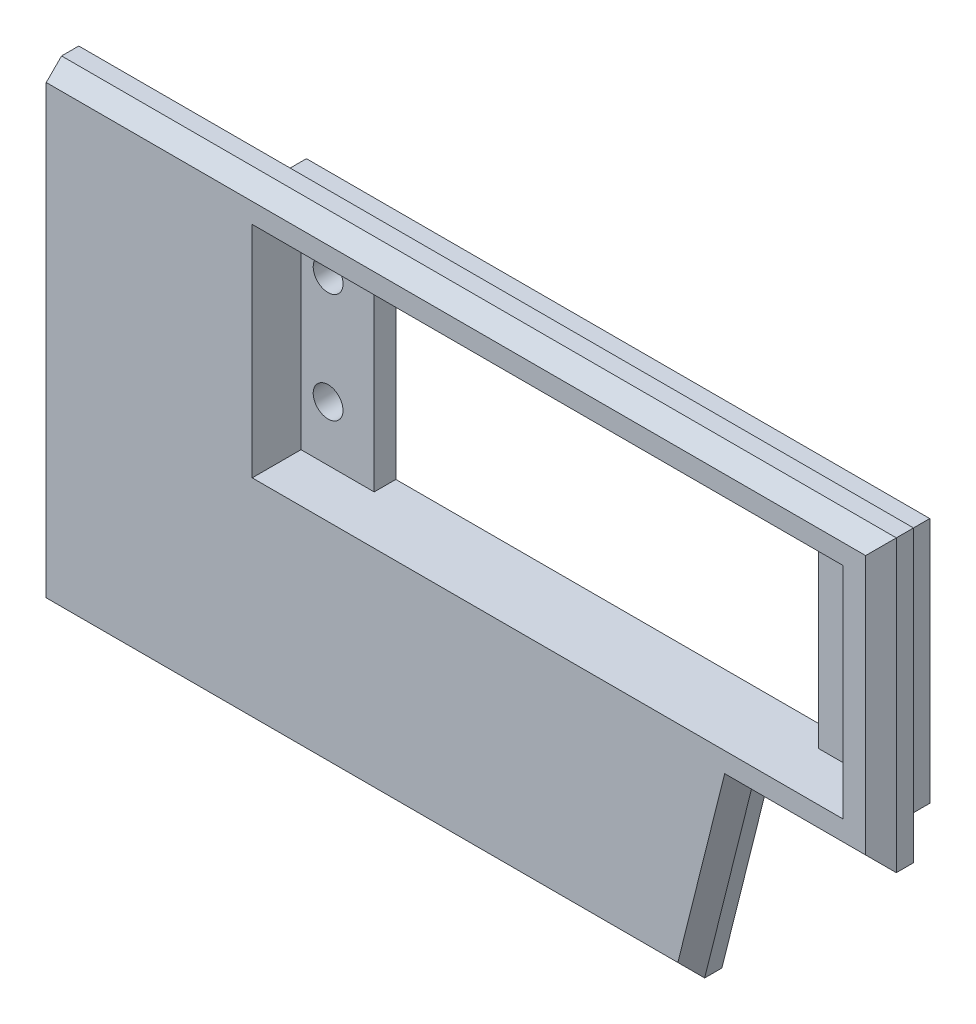
ISO-10303-21;
HEADER;
FILE_DESCRIPTION(('STEP AP214'),'2;1');
FILE_NAME('part.step','',(''),(''),'','','');
FILE_SCHEMA(('AUTOMOTIVE_DESIGN { 1 0 10303 214 1 1 1 1 }'));
ENDSEC;
DATA;
#1=APPLICATION_CONTEXT('core data for automotive mechanical design processes');
#2=APPLICATION_PROTOCOL_DEFINITION('international standard','automotive_design',2000,#1);
#3=PRODUCT_CONTEXT('',#1,'mechanical');
#4=PRODUCT('Part','Part','',(#3));
#5=PRODUCT_RELATED_PRODUCT_CATEGORY('part','',(#4));
#6=PRODUCT_DEFINITION_FORMATION('','',#4);
#7=PRODUCT_DEFINITION_CONTEXT('part definition',#1,'design');
#8=PRODUCT_DEFINITION('design','',#6,#7);
#9=PRODUCT_DEFINITION_SHAPE('','',#8);
#10=(LENGTH_UNIT() NAMED_UNIT(*) SI_UNIT(.MILLI.,.METRE.));
#11=(NAMED_UNIT(*) PLANE_ANGLE_UNIT() SI_UNIT($,.RADIAN.));
#12=(NAMED_UNIT(*) SI_UNIT($,.STERADIAN.) SOLID_ANGLE_UNIT());
#13=UNCERTAINTY_MEASURE_WITH_UNIT(LENGTH_MEASURE(1.E-05),#10,'distance_accuracy_value','');
#14=(GEOMETRIC_REPRESENTATION_CONTEXT(3) GLOBAL_UNCERTAINTY_ASSIGNED_CONTEXT((#13)) GLOBAL_UNIT_ASSIGNED_CONTEXT((#10,
#11,#12)) REPRESENTATION_CONTEXT('',''));
#15=CARTESIAN_POINT('',(0.,0.,0.));
#16=DIRECTION('',(0.,0.,1.));
#17=DIRECTION('',(1.,0.,0.));
#18=AXIS2_PLACEMENT_3D('',#15,#16,#17);
#19=CARTESIAN_POINT('',(-40.767008156925,24.,3.));
#20=DIRECTION('',(1.,0.,0.));
#21=DIRECTION('',(0.,1.,0.));
#22=AXIS2_PLACEMENT_3D('',#19,#20,#21);
#23=PLANE('',#22);
#24=DIRECTION('',(0.,0.,-1.));
#25=VECTOR('',#24,1.);
#26=CARTESIAN_POINT('',(-40.767008156925,-3.99999999999996,21.0581800256037));
#27=LINE('',#26,#25);
#28=CARTESIAN_POINT('',(-40.767008156925,-3.99999999999996,1.5));
#29=VERTEX_POINT('',#28);
#30=CARTESIAN_POINT('',(-40.767008156925,-3.99999999999996,0.));
#31=VERTEX_POINT('',#30);
#32=EDGE_CURVE('E212',#29,#31,#27,.T.);
#33=ORIENTED_EDGE('',*,*,#32,.F.);
#34=DIRECTION('',(0.,-1.,0.));
#35=VECTOR('',#34,1.);
#36=CARTESIAN_POINT('',(-40.767008156925,-3.99999999999996,1.5));
#37=LINE('',#36,#35);
#38=CARTESIAN_POINT('',(-40.767008156925,-6.99999999999996,1.5));
#39=VERTEX_POINT('',#38);
#40=EDGE_CURVE('E331',#29,#39,#37,.T.);
#41=ORIENTED_EDGE('',*,*,#40,.T.);
#42=DIRECTION('',(0.,0.,-1.));
#43=VECTOR('',#42,1.);
#44=CARTESIAN_POINT('',(-40.767008156925,-6.99999999999996,21.0581800256037));
#45=LINE('',#44,#43);
#46=CARTESIAN_POINT('',(-40.767008156925,-6.99999999999996,0.));
#47=VERTEX_POINT('',#46);
#48=EDGE_CURVE('E332',#39,#47,#45,.T.);
#49=ORIENTED_EDGE('',*,*,#48,.T.);
#50=DIRECTION('',(0.,-1.,0.));
#51=VECTOR('',#50,1.);
#52=CARTESIAN_POINT('',(-40.767008156925,24.,0.));
#53=LINE('',#52,#51);
#54=CARTESIAN_POINT('',(-40.767008156925,-20.,0.));
#55=VERTEX_POINT('',#54);
#56=EDGE_CURVE('E239',#47,#55,#53,.T.);
#57=ORIENTED_EDGE('',*,*,#56,.T.);
#58=DIRECTION('',(0.,0.,-1.));
#59=VECTOR('',#58,1.);
#60=CARTESIAN_POINT('',(-40.767008156925,-20.,3.));
#61=LINE('',#60,#59);
#62=CARTESIAN_POINT('',(-40.767008156925,-20.0000000000001,1.58578643762691));
#63=VERTEX_POINT('',#62);
#64=EDGE_CURVE('E248',#63,#55,#61,.T.);
#65=ORIENTED_EDGE('',*,*,#64,.F.);
#66=DIRECTION('',(0.,0.707106781186547,0.707106781186548));
#67=VECTOR('',#66,1.);
#68=CARTESIAN_POINT('',(-40.767008156925,-18.585786437627,3.));
#69=LINE('',#68,#67);
#70=CARTESIAN_POINT('',(-40.767008156925,-18.585786437627,3.));
#71=VERTEX_POINT('',#70);
#72=EDGE_CURVE('E288',#63,#71,#69,.T.);
#73=ORIENTED_EDGE('',*,*,#72,.T.);
#74=DIRECTION('',(0.,-1.,0.));
#75=VECTOR('',#74,1.);
#76=CARTESIAN_POINT('',(-40.767008156925,24.,3.));
#77=LINE('',#76,#75);
#78=CARTESIAN_POINT('',(-40.767008156925,22.5857864376268,3.));
#79=VERTEX_POINT('',#78);
#80=EDGE_CURVE('E241',#79,#71,#77,.T.);
#81=ORIENTED_EDGE('',*,*,#80,.F.);
#82=DIRECTION('',(0.,0.707106781186548,-0.707106781186547));
#83=VECTOR('',#82,1.);
#84=CARTESIAN_POINT('',(-40.767008156925,12.7928932188134,12.7928932188134));
#85=LINE('',#84,#83);
#86=CARTESIAN_POINT('',(-40.767008156925,24.,1.58578643762686));
#87=VERTEX_POINT('',#86);
#88=EDGE_CURVE('E290',#79,#87,#85,.T.);
#89=ORIENTED_EDGE('',*,*,#88,.T.);
#90=DIRECTION('',(0.,0.,-1.));
#91=VECTOR('',#90,1.);
#92=CARTESIAN_POINT('',(-40.767008156925,24.,3.));
#93=LINE('',#92,#91);
#94=CARTESIAN_POINT('',(-40.767008156925,24.,0.));
#95=VERTEX_POINT('',#94);
#96=EDGE_CURVE('E233',#87,#95,#93,.T.);
#97=ORIENTED_EDGE('',*,*,#96,.T.);
#98=EDGE_CURVE('E228',#95,#31,#53,.T.);
#99=ORIENTED_EDGE('',*,*,#98,.T.);
#100=EDGE_LOOP('',(#33,#41,#49,#57,#65,#73,#81,#89,#97,#99));
#101=FACE_BOUND('',#100,.T.);
#102=ADVANCED_FACE('F44',(#101),#23,.F.);
#103=CARTESIAN_POINT('',(0.,0.,-1.5));
#104=DIRECTION('',(0.,0.,1.));
#105=DIRECTION('',(1.,0.,0.));
#106=AXIS2_PLACEMENT_3D('',#103,#104,#105);
#107=PLANE('',#106);
#108=CARTESIAN_POINT('',(30.232991843075,5.57500000000003,-1.5));
#109=DIRECTION('',(0.,0.,1.));
#110=DIRECTION('',(-1.,0.,0.));
#111=AXIS2_PLACEMENT_3D('',#108,#109,#110);
#112=CIRCLE('',#111,1.375);
#113=CARTESIAN_POINT('',(28.8579918430749,5.57500000000003,-1.5));
#114=VERTEX_POINT('',#113);
#115=EDGE_CURVE('E351',#114,#114,#112,.T.);
#116=ORIENTED_EDGE('',*,*,#115,.F.);
#117=EDGE_LOOP('',(#116));
#118=FACE_BOUND('',#117,.T.);
#119=CARTESIAN_POINT('',(30.232991843075,15.675,-1.5));
#120=DIRECTION('',(0.,0.,1.));
#121=DIRECTION('',(1.,0.,0.));
#122=AXIS2_PLACEMENT_3D('',#119,#120,#121);
#123=CIRCLE('',#122,1.375);
#124=CARTESIAN_POINT('',(31.607991843075,15.675,-1.5));
#125=VERTEX_POINT('',#124);
#126=EDGE_CURVE('E363',#125,#125,#123,.T.);
#127=ORIENTED_EDGE('',*,*,#126,.F.);
#128=EDGE_LOOP('',(#127));
#129=FACE_BOUND('',#128,.T.);
#130=DIRECTION('',(0.,1.,0.));
#131=VECTOR('',#130,1.);
#132=CARTESIAN_POINT('',(25.982991843075,20.75,-1.5));
#133=LINE('',#132,#131);
#134=CARTESIAN_POINT('',(25.982991843075,0.500000000000039,-1.5));
#135=VERTEX_POINT('',#134);
#136=CARTESIAN_POINT('',(25.982991843075,20.75,-1.5));
#137=VERTEX_POINT('',#136);
#138=EDGE_CURVE('E368',#135,#137,#133,.T.);
#139=ORIENTED_EDGE('',*,*,#138,.F.);
#140=DIRECTION('',(1.,0.,0.));
#141=VECTOR('',#140,1.);
#142=CARTESIAN_POINT('',(-21.767008156925,0.500000000000032,-1.5));
#143=LINE('',#142,#141);
#144=CARTESIAN_POINT('',(32.732991843075,0.500000000000032,-1.5));
#145=VERTEX_POINT('',#144);
#146=EDGE_CURVE('E408',#135,#145,#143,.T.);
#147=ORIENTED_EDGE('',*,*,#146,.T.);
#148=DIRECTION('',(0.,1.,0.));
#149=VECTOR('',#148,1.);
#150=CARTESIAN_POINT('',(32.732991843075,20.75,-1.5));
#151=LINE('',#150,#149);
#152=CARTESIAN_POINT('',(32.732991843075,20.75,-1.5));
#153=VERTEX_POINT('',#152);
#154=EDGE_CURVE('E394',#145,#153,#151,.T.);
#155=ORIENTED_EDGE('',*,*,#154,.T.);
#156=DIRECTION('',(-1.,0.,0.));
#157=VECTOR('',#156,1.);
#158=CARTESIAN_POINT('',(-21.767008156925,20.75,-1.5));
#159=LINE('',#158,#157);
#160=EDGE_CURVE('E397',#153,#137,#159,.T.);
#161=ORIENTED_EDGE('',*,*,#160,.T.);
#162=EDGE_LOOP('',(#139,#147,#155,#161));
#163=FACE_BOUND('',#162,.T.);
#164=ADVANCED_FACE('F477',(#118,#129,#163),#107,.T.);
#165=CARTESIAN_POINT('',(0.,0.,3.));
#166=DIRECTION('',(0.,0.,-1.));
#167=DIRECTION('',(-1.,0.,0.));
#168=AXIS2_PLACEMENT_3D('',#165,#166,#167);
#169=PLANE('',#168);
#170=DIRECTION('',(-1.,0.,0.));
#171=VECTOR('',#170,1.);
#172=CARTESIAN_POINT('',(-21.767008156925,20.75,3.));
#173=LINE('',#172,#171);
#174=CARTESIAN_POINT('',(32.732991843075,20.75,3.));
#175=VERTEX_POINT('',#174);
#176=CARTESIAN_POINT('',(-21.767008156925,20.75,3.));
#177=VERTEX_POINT('',#176);
#178=EDGE_CURVE('E415',#175,#177,#173,.T.);
#179=ORIENTED_EDGE('',*,*,#178,.F.);
#180=DIRECTION('',(0.,1.,0.));
#181=VECTOR('',#180,1.);
#182=CARTESIAN_POINT('',(32.732991843075,20.75,3.));
#183=LINE('',#182,#181);
#184=CARTESIAN_POINT('',(32.732991843075,0.500000000000032,3.));
#185=VERTEX_POINT('',#184);
#186=EDGE_CURVE('E392',#185,#175,#183,.T.);
#187=ORIENTED_EDGE('',*,*,#186,.F.);
#188=DIRECTION('',(1.,0.,0.));
#189=VECTOR('',#188,1.);
#190=CARTESIAN_POINT('',(-21.767008156925,0.500000000000032,3.));
#191=LINE('',#190,#189);
#192=CARTESIAN_POINT('',(-21.767008156925,0.500000000000032,3.));
#193=VERTEX_POINT('',#192);
#194=EDGE_CURVE('E398',#193,#185,#191,.T.);
#195=ORIENTED_EDGE('',*,*,#194,.F.);
#196=DIRECTION('',(0.,-1.,0.));
#197=VECTOR('',#196,1.);
#198=CARTESIAN_POINT('',(-21.767008156925,20.75,3.));
#199=LINE('',#198,#197);
#200=EDGE_CURVE('E412',#177,#193,#199,.T.);
#201=ORIENTED_EDGE('',*,*,#200,.F.);
#202=EDGE_LOOP('',(#179,#187,#195,#201));
#203=FACE_BOUND('',#202,.T.);
#204=DIRECTION('',(-0.242848738025432,-0.970064168207163,0.));
#205=VECTOR('',#204,1.);
#206=CARTESIAN_POINT('',(22.2340667313342,0.34138451176681,3.));
#207=LINE('',#206,#205);
#208=CARTESIAN_POINT('',(21.8141987866539,-1.3357864376269,3.));
#209=VERTEX_POINT('',#208);
#210=CARTESIAN_POINT('',(17.4957826774589,-18.5857864376269,3.));
#211=VERTEX_POINT('',#210);
#212=EDGE_CURVE('E277',#209,#211,#207,.T.);
#213=ORIENTED_EDGE('',*,*,#212,.F.);
#214=DIRECTION('',(1.,0.,0.));
#215=VECTOR('',#214,1.);
#216=CARTESIAN_POINT('',(21.0205335015628,-1.3357864376269,3.));
#217=LINE('',#216,#215);
#218=CARTESIAN_POINT('',(34.8187782807019,-1.33578643762689,3.));
#219=VERTEX_POINT('',#218);
#220=EDGE_CURVE('E261',#209,#219,#217,.T.);
#221=ORIENTED_EDGE('',*,*,#220,.T.);
#222=DIRECTION('',(0.,-1.,0.));
#223=VECTOR('',#222,1.);
#224=CARTESIAN_POINT('',(34.8187782807018,24.,3.));
#225=LINE('',#224,#223);
#226=CARTESIAN_POINT('',(34.8187782807018,22.5857864376268,3.));
#227=VERTEX_POINT('',#226);
#228=EDGE_CURVE('E274',#227,#219,#225,.T.);
#229=ORIENTED_EDGE('',*,*,#228,.F.);
#230=DIRECTION('',(1.,0.,0.));
#231=VECTOR('',#230,1.);
#232=CARTESIAN_POINT('',(-40.7680081569251,22.5857864376268,3.));
#233=LINE('',#232,#231);
#234=EDGE_CURVE('E291',#79,#227,#233,.T.);
#235=ORIENTED_EDGE('',*,*,#234,.F.);
#236=ORIENTED_EDGE('',*,*,#80,.T.);
#237=DIRECTION('',(1.,0.,0.));
#238=VECTOR('',#237,1.);
#239=CARTESIAN_POINT('',(-40.768008156925,-18.585786437627,3.));
#240=LINE('',#239,#238);
#241=EDGE_CURVE('E282',#71,#211,#240,.T.);
#242=ORIENTED_EDGE('',*,*,#241,.T.);
#243=EDGE_LOOP('',(#213,#221,#229,#235,#236,#242));
#244=FACE_BOUND('',#243,.T.);
#245=ADVANCED_FACE('F273',(#203,#244),#169,.F.);
#246=CARTESIAN_POINT('',(22.8743739357172,-2.74999999999997,3.));
#247=DIRECTION('',(0.,1.,0.));
#248=DIRECTION('',(0.,0.,1.));
#249=AXIS2_PLACEMENT_3D('',#246,#247,#248);
#250=PLANE('',#249);
#251=DIRECTION('',(1.,0.,0.));
#252=VECTOR('',#251,1.);
#253=CARTESIAN_POINT('',(21.0205335015628,-2.74999999999998,1.58578643762691));
#254=LINE('',#253,#252);
#255=CARTESIAN_POINT('',(22.8743739357172,-2.74999999999999,1.58578643762691));
#256=VERTEX_POINT('',#255);
#257=CARTESIAN_POINT('',(36.232991843075,-2.74999999999997,1.58578643762692));
#258=VERTEX_POINT('',#257);
#259=EDGE_CURVE('E266',#256,#258,#254,.T.);
#260=ORIENTED_EDGE('',*,*,#259,.F.);
#261=DIRECTION('',(0.,0.,-1.));
#262=VECTOR('',#261,1.);
#263=CARTESIAN_POINT('',(22.8743739357172,-2.74999999999997,3.));
#264=LINE('',#263,#262);
#265=CARTESIAN_POINT('',(22.8743739357172,-2.74999999999997,0.));
#266=VERTEX_POINT('',#265);
#267=EDGE_CURVE('E257',#256,#266,#264,.T.);
#268=ORIENTED_EDGE('',*,*,#267,.T.);
#269=DIRECTION('',(1.,0.,0.));
#270=VECTOR('',#269,1.);
#271=CARTESIAN_POINT('',(22.8743739357172,-2.74999999999997,0.));
#272=LINE('',#271,#270);
#273=CARTESIAN_POINT('',(36.232991843075,-2.74999999999997,0.));
#274=VERTEX_POINT('',#273);
#275=EDGE_CURVE('E307',#266,#274,#272,.T.);
#276=ORIENTED_EDGE('',*,*,#275,.T.);
#277=DIRECTION('',(0.,0.,-1.));
#278=VECTOR('',#277,1.);
#279=CARTESIAN_POINT('',(36.232991843075,-2.74999999999997,3.));
#280=LINE('',#279,#278);
#281=EDGE_CURVE('E254',#258,#274,#280,.T.);
#282=ORIENTED_EDGE('',*,*,#281,.F.);
#283=EDGE_LOOP('',(#260,#268,#276,#282));
#284=FACE_BOUND('',#283,.T.);
#285=ADVANCED_FACE('F469',(#284),#250,.F.);
#286=CARTESIAN_POINT('',(36.232991843075,-2.74999999999997,3.));
#287=DIRECTION('',(-1.,0.,0.));
#288=DIRECTION('',(0.,-1.,0.));
#289=AXIS2_PLACEMENT_3D('',#286,#287,#288);
#290=PLANE('',#289);
#291=DIRECTION('',(0.,0.,-1.));
#292=VECTOR('',#291,1.);
#293=CARTESIAN_POINT('',(36.232991843075,24.,3.));
#294=LINE('',#293,#292);
#295=CARTESIAN_POINT('',(36.232991843075,24.,1.58578643762692));
#296=VERTEX_POINT('',#295);
#297=CARTESIAN_POINT('',(36.232991843075,24.,0.));
#298=VERTEX_POINT('',#297);
#299=EDGE_CURVE('E253',#296,#298,#294,.T.);
#300=ORIENTED_EDGE('',*,*,#299,.F.);
#301=DIRECTION('',(0.,-1.,0.));
#302=VECTOR('',#301,1.);
#303=CARTESIAN_POINT('',(36.232991843075,24.,1.58578643762692));
#304=LINE('',#303,#302);
#305=EDGE_CURVE('E284',#296,#258,#304,.T.);
#306=ORIENTED_EDGE('',*,*,#305,.T.);
#307=ORIENTED_EDGE('',*,*,#281,.T.);
#308=DIRECTION('',(0.,1.,0.));
#309=VECTOR('',#308,1.);
#310=CARTESIAN_POINT('',(36.232991843075,-2.74999999999997,0.));
#311=LINE('',#310,#309);
#312=EDGE_CURVE('E306',#274,#298,#311,.T.);
#313=ORIENTED_EDGE('',*,*,#312,.T.);
#314=EDGE_LOOP('',(#300,#306,#307,#313));
#315=FACE_BOUND('',#314,.T.);
#316=ADVANCED_FACE('F467',(#315),#290,.F.);
#317=CARTESIAN_POINT('',(-40.767008156925,-20.,3.));
#318=DIRECTION('',(0.,1.,0.));
#319=DIRECTION('',(0.,0.,1.));
#320=AXIS2_PLACEMENT_3D('',#317,#318,#319);
#321=PLANE('',#320);
#322=DIRECTION('',(1.,0.,0.));
#323=VECTOR('',#322,1.);
#324=CARTESIAN_POINT('',(-40.768008156925,-20.0000000000001,1.58578643762691));
#325=LINE('',#324,#323);
#326=CARTESIAN_POINT('',(18.5559578265221,-20.,1.58578643762691));
#327=VERTEX_POINT('',#326);
#328=EDGE_CURVE('E296',#63,#327,#325,.T.);
#329=ORIENTED_EDGE('',*,*,#328,.F.);
#330=ORIENTED_EDGE('',*,*,#64,.T.);
#331=DIRECTION('',(1.,0.,0.));
#332=VECTOR('',#331,1.);
#333=CARTESIAN_POINT('',(-40.767008156925,-20.,0.));
#334=LINE('',#333,#332);
#335=CARTESIAN_POINT('',(18.5559578265221,-20.,0.));
#336=VERTEX_POINT('',#335);
#337=EDGE_CURVE('E240',#55,#336,#334,.T.);
#338=ORIENTED_EDGE('',*,*,#337,.T.);
#339=DIRECTION('',(0.,0.,-1.));
#340=VECTOR('',#339,1.);
#341=CARTESIAN_POINT('',(18.5559578265221,-20.,3.));
#342=LINE('',#341,#340);
#343=EDGE_CURVE('E246',#327,#336,#342,.T.);
#344=ORIENTED_EDGE('',*,*,#343,.F.);
#345=EDGE_LOOP('',(#329,#330,#338,#344));
#346=FACE_BOUND('',#345,.T.);
#347=ADVANCED_FACE('F330',(#346),#321,.F.);
#348=CARTESIAN_POINT('',(18.5559578265221,-20.,3.));
#349=DIRECTION('',(-0.970064168207163,0.242848738025431,0.));
#350=DIRECTION('',(-0.242848738025431,-0.970064168207163,0.));
#351=AXIS2_PLACEMENT_3D('',#348,#349,#350);
#352=PLANE('',#351);
#353=ORIENTED_EDGE('',*,*,#267,.F.);
#354=DIRECTION('',(-0.242848738025432,-0.970064168207163,0.));
#355=VECTOR('',#354,1.);
#356=CARTESIAN_POINT('',(23.6482802937073,0.34138451176681,1.58578643762691));
#357=LINE('',#356,#355);
#358=EDGE_CURVE('E323',#256,#327,#357,.T.);
#359=ORIENTED_EDGE('',*,*,#358,.T.);
#360=ORIENTED_EDGE('',*,*,#343,.T.);
#361=DIRECTION('',(0.242848738025431,0.970064168207163,0.));
#362=VECTOR('',#361,1.);
#363=CARTESIAN_POINT('',(18.5559578265221,-20.,0.));
#364=LINE('',#363,#362);
#365=EDGE_CURVE('E293',#336,#266,#364,.T.);
#366=ORIENTED_EDGE('',*,*,#365,.T.);
#367=EDGE_LOOP('',(#353,#359,#360,#366));
#368=FACE_BOUND('',#367,.T.);
#369=ADVANCED_FACE('F50',(#368),#352,.F.);
#370=CARTESIAN_POINT('',(36.232991843075,24.,3.));
#371=DIRECTION('',(0.,-1.,0.));
#372=DIRECTION('',(0.,0.,-1.));
#373=AXIS2_PLACEMENT_3D('',#370,#371,#372);
#374=PLANE('',#373);
#375=ORIENTED_EDGE('',*,*,#96,.F.);
#376=DIRECTION('',(1.,0.,0.));
#377=VECTOR('',#376,1.);
#378=CARTESIAN_POINT('',(-40.7680081569251,23.9999999999999,1.58578643762686));
#379=LINE('',#378,#377);
#380=EDGE_CURVE('E286',#87,#296,#379,.T.);
#381=ORIENTED_EDGE('',*,*,#380,.T.);
#382=ORIENTED_EDGE('',*,*,#299,.T.);
#383=DIRECTION('',(-1.,0.,0.));
#384=VECTOR('',#383,1.);
#385=CARTESIAN_POINT('',(36.232991843075,24.,0.));
#386=LINE('',#385,#384);
#387=EDGE_CURVE('E243',#298,#95,#386,.T.);
#388=ORIENTED_EDGE('',*,*,#387,.T.);
#389=EDGE_LOOP('',(#375,#381,#382,#388));
#390=FACE_BOUND('',#389,.T.);
#391=ADVANCED_FACE('F311',(#390),#374,.F.);
#392=CARTESIAN_POINT('',(0.,0.,0.));
#393=DIRECTION('',(0.,0.,-1.));
#394=DIRECTION('',(-1.,0.,0.));
#395=AXIS2_PLACEMENT_3D('',#392,#393,#394);
#396=PLANE('',#395);
#397=DIRECTION('',(1.,0.,0.));
#398=VECTOR('',#397,1.);
#399=CARTESIAN_POINT('',(-22.9597662077317,-3.99999999999996,0.));
#400=LINE('',#399,#398);
#401=CARTESIAN_POINT('',(-22.9597662077317,-3.99999999999996,0.));
#402=VERTEX_POINT('',#401);
#403=EDGE_CURVE('E58',#31,#402,#400,.T.);
#404=ORIENTED_EDGE('',*,*,#403,.F.);
#405=ORIENTED_EDGE('',*,*,#98,.F.);
#406=ORIENTED_EDGE('',*,*,#387,.F.);
#407=ORIENTED_EDGE('',*,*,#312,.F.);
#408=ORIENTED_EDGE('',*,*,#275,.F.);
#409=ORIENTED_EDGE('',*,*,#365,.F.);
#410=ORIENTED_EDGE('',*,*,#337,.F.);
#411=ORIENTED_EDGE('',*,*,#56,.F.);
#412=DIRECTION('',(-1.,0.,0.));
#413=VECTOR('',#412,1.);
#414=CARTESIAN_POINT('',(-22.9597662077317,-6.99999999999996,0.));
#415=LINE('',#414,#413);
#416=CARTESIAN_POINT('',(-22.9597662077317,-6.99999999999996,0.));
#417=VERTEX_POINT('',#416);
#418=EDGE_CURVE('E219',#417,#47,#415,.T.);
#419=ORIENTED_EDGE('',*,*,#418,.F.);
#420=DIRECTION('',(0.,-1.,0.));
#421=VECTOR('',#420,1.);
#422=CARTESIAN_POINT('',(-22.9597662077317,-3.99999999999996,0.));
#423=LINE('',#422,#421);
#424=EDGE_CURVE('E232',#402,#417,#423,.T.);
#425=ORIENTED_EDGE('',*,*,#424,.F.);
#426=EDGE_LOOP('',(#404,#405,#406,#407,#408,#409,#410,#411,#419,#425));
#427=FACE_BOUND('',#426,.T.);
#428=DIRECTION('',(1.,0.,0.));
#429=VECTOR('',#428,1.);
#430=CARTESIAN_POINT('',(0.,22.,0.));
#431=LINE('',#430,#429);
#432=CARTESIAN_POINT('',(-23.267008156925,22.,0.));
#433=VERTEX_POINT('',#432);
#434=CARTESIAN_POINT('',(34.232991843075,22.,0.));
#435=VERTEX_POINT('',#434);
#436=EDGE_CURVE('E425',#433,#435,#431,.T.);
#437=ORIENTED_EDGE('',*,*,#436,.F.);
#438=DIRECTION('',(0.,-1.,0.));
#439=VECTOR('',#438,1.);
#440=CARTESIAN_POINT('',(-23.267008156925,0.,0.));
#441=LINE('',#440,#439);
#442=CARTESIAN_POINT('',(-23.267008156925,-0.749999999999973,0.));
#443=VERTEX_POINT('',#442);
#444=EDGE_CURVE('E434',#433,#443,#441,.T.);
#445=ORIENTED_EDGE('',*,*,#444,.T.);
#446=DIRECTION('',(1.,0.,0.));
#447=VECTOR('',#446,1.);
#448=CARTESIAN_POINT('',(0.,-0.749999999999973,0.));
#449=LINE('',#448,#447);
#450=CARTESIAN_POINT('',(34.232991843075,-0.749999999999973,0.));
#451=VERTEX_POINT('',#450);
#452=EDGE_CURVE('E446',#443,#451,#449,.T.);
#453=ORIENTED_EDGE('',*,*,#452,.T.);
#454=DIRECTION('',(0.,-1.,0.));
#455=VECTOR('',#454,1.);
#456=CARTESIAN_POINT('',(34.232991843075,0.,0.));
#457=LINE('',#456,#455);
#458=EDGE_CURVE('E442',#435,#451,#457,.T.);
#459=ORIENTED_EDGE('',*,*,#458,.F.);
#460=EDGE_LOOP('',(#437,#445,#453,#459));
#461=FACE_BOUND('',#460,.T.);
#462=ADVANCED_FACE('F222',(#427,#461),#396,.T.);
#463=CARTESIAN_POINT('',(-40.768008156925,-18.585786437627,3.));
#464=DIRECTION('',(0.,-0.707106781186548,0.707106781186547));
#465=DIRECTION('',(0.,-0.707106781186547,-0.707106781186548));
#466=AXIS2_PLACEMENT_3D('',#463,#464,#465);
#467=PLANE('',#466);
#468=DIRECTION('',(0.46835404316471,-0.624757749152129,-0.62475774915213));
#469=VECTOR('',#468,1.);
#470=CARTESIAN_POINT('',(4.71529913908916,-1.53734574401338,20.0484406936136));
#471=LINE('',#470,#469);
#472=EDGE_CURVE('E12',#211,#327,#471,.T.);
#473=ORIENTED_EDGE('',*,*,#472,.F.);
#474=ORIENTED_EDGE('',*,*,#241,.F.);
#475=ORIENTED_EDGE('',*,*,#72,.F.);
#476=ORIENTED_EDGE('',*,*,#328,.T.);
#477=EDGE_LOOP('',(#473,#474,#475,#476));
#478=FACE_BOUND('',#477,.T.);
#479=ADVANCED_FACE('F497',(#478),#467,.T.);
#480=CARTESIAN_POINT('',(-40.7680081569251,12.7928932188134,12.7928932188134));
#481=DIRECTION('',(0.,0.707106781186547,0.707106781186548));
#482=DIRECTION('',(0.,-0.707106781186548,0.707106781186547));
#483=AXIS2_PLACEMENT_3D('',#480,#481,#482);
#484=PLANE('',#483);
#485=DIRECTION('',(-0.577350269189631,-0.577350269189624,0.577350269189623));
#486=VECTOR('',#485,1.);
#487=CARTESIAN_POINT('',(3.09458732228343,-9.13840452079116,34.7241909584179));
#488=LINE('',#487,#486);
#489=EDGE_CURVE('E278',#296,#227,#488,.T.);
#490=ORIENTED_EDGE('',*,*,#489,.F.);
#491=ORIENTED_EDGE('',*,*,#380,.F.);
#492=ORIENTED_EDGE('',*,*,#88,.F.);
#493=ORIENTED_EDGE('',*,*,#234,.T.);
#494=EDGE_LOOP('',(#490,#491,#492,#493));
#495=FACE_BOUND('',#494,.T.);
#496=ADVANCED_FACE('F468',(#495),#484,.T.);
#497=CARTESIAN_POINT('',(21.0205335015628,-2.16789321881344,2.16789321881346));
#498=DIRECTION('',(0.,0.707106781186547,-0.707106781186548));
#499=DIRECTION('',(0.,0.707106781186548,0.707106781186547));
#500=AXIS2_PLACEMENT_3D('',#497,#498,#499);
#501=PLANE('',#500);
#502=ORIENTED_EDGE('',*,*,#259,.T.);
#503=DIRECTION('',(-0.577350269189631,0.577350269189623,0.577350269189623));
#504=VECTOR('',#503,1.);
#505=CARTESIAN_POINT('',(30.7741012084464,2.70889063462846,7.04467707225535));
#506=LINE('',#505,#504);
#507=EDGE_CURVE('E52',#258,#219,#506,.T.);
#508=ORIENTED_EDGE('',*,*,#507,.T.);
#509=ORIENTED_EDGE('',*,*,#220,.F.);
#510=DIRECTION('',(0.468354043164709,-0.62475774915213,-0.624757749152129));
#511=VECTOR('',#510,1.);
#512=CARTESIAN_POINT('',(22.1395712833602,-1.76981490742434,2.56597153020256));
#513=LINE('',#512,#511);
#514=EDGE_CURVE('E462',#209,#256,#513,.T.);
#515=ORIENTED_EDGE('',*,*,#514,.T.);
#516=EDGE_LOOP('',(#502,#508,#509,#515));
#517=FACE_BOUND('',#516,.T.);
#518=ADVANCED_FACE('F265',(#517),#501,.F.);
#519=CARTESIAN_POINT('',(36.232991843075,24.,1.58578643762692));
#520=DIRECTION('',(-0.707106781186542,0.,-0.707106781186553));
#521=DIRECTION('',(-0.707106781186553,0.,0.707106781186542));
#522=AXIS2_PLACEMENT_3D('',#519,#520,#521);
#523=PLANE('',#522);
#524=ORIENTED_EDGE('',*,*,#489,.T.);
#525=ORIENTED_EDGE('',*,*,#228,.T.);
#526=ORIENTED_EDGE('',*,*,#507,.F.);
#527=ORIENTED_EDGE('',*,*,#305,.F.);
#528=EDGE_LOOP('',(#524,#525,#526,#527));
#529=FACE_BOUND('',#528,.T.);
#530=ADVANCED_FACE('F463',(#529),#523,.F.);
#531=CARTESIAN_POINT('',(23.6482802937073,0.34138451176681,1.58578643762691));
#532=DIRECTION('',(-0.69628165926866,0.174309213560744,-0.696281659268659));
#533=DIRECTION('',(-0.707106781186547,0.,0.707106781186548));
#534=AXIS2_PLACEMENT_3D('',#531,#532,#533);
#535=PLANE('',#534);
#536=ORIENTED_EDGE('',*,*,#472,.T.);
#537=ORIENTED_EDGE('',*,*,#358,.F.);
#538=ORIENTED_EDGE('',*,*,#514,.F.);
#539=ORIENTED_EDGE('',*,*,#212,.T.);
#540=EDGE_LOOP('',(#536,#537,#538,#539));
#541=FACE_BOUND('',#540,.T.);
#542=ADVANCED_FACE('F548',(#541),#535,.F.);
#543=CARTESIAN_POINT('',(0.,22.,-3.5));
#544=DIRECTION('',(0.,-1.,0.));
#545=DIRECTION('',(0.,0.,-1.));
#546=AXIS2_PLACEMENT_3D('',#543,#544,#545);
#547=PLANE('',#546);
#548=ORIENTED_EDGE('',*,*,#436,.T.);
#549=DIRECTION('',(0.,0.,1.));
#550=VECTOR('',#549,1.);
#551=CARTESIAN_POINT('',(34.232991843075,22.,-3.5));
#552=LINE('',#551,#550);
#553=CARTESIAN_POINT('',(34.232991843075,22.,-3.5));
#554=VERTEX_POINT('',#553);
#555=EDGE_CURVE('E456',#554,#435,#552,.T.);
#556=ORIENTED_EDGE('',*,*,#555,.F.);
#557=DIRECTION('',(1.,0.,0.));
#558=VECTOR('',#557,1.);
#559=CARTESIAN_POINT('',(0.,22.,-3.5));
#560=LINE('',#559,#558);
#561=CARTESIAN_POINT('',(-23.267008156925,22.,-3.5));
#562=VERTEX_POINT('',#561);
#563=EDGE_CURVE('E428',#562,#554,#560,.T.);
#564=ORIENTED_EDGE('',*,*,#563,.F.);
#565=DIRECTION('',(0.,0.,1.));
#566=VECTOR('',#565,1.);
#567=CARTESIAN_POINT('',(-23.267008156925,22.,-3.5));
#568=LINE('',#567,#566);
#569=EDGE_CURVE('E441',#562,#433,#568,.T.);
#570=ORIENTED_EDGE('',*,*,#569,.T.);
#571=EDGE_LOOP('',(#548,#556,#564,#570));
#572=FACE_BOUND('',#571,.T.);
#573=ADVANCED_FACE('F566',(#572),#547,.F.);
#574=CARTESIAN_POINT('',(34.232991843075,0.,-3.5));
#575=DIRECTION('',(-1.,0.,0.));
#576=DIRECTION('',(0.,0.,1.));
#577=AXIS2_PLACEMENT_3D('',#574,#575,#576);
#578=PLANE('',#577);
#579=ORIENTED_EDGE('',*,*,#458,.T.);
#580=DIRECTION('',(0.,0.,1.));
#581=VECTOR('',#580,1.);
#582=CARTESIAN_POINT('',(34.232991843075,-0.749999999999973,-3.5));
#583=LINE('',#582,#581);
#584=CARTESIAN_POINT('',(34.232991843075,-0.749999999999973,-3.5));
#585=VERTEX_POINT('',#584);
#586=EDGE_CURVE('E454',#585,#451,#583,.T.);
#587=ORIENTED_EDGE('',*,*,#586,.F.);
#588=DIRECTION('',(0.,-1.,0.));
#589=VECTOR('',#588,1.);
#590=CARTESIAN_POINT('',(34.232991843075,0.,-3.5));
#591=LINE('',#590,#589);
#592=EDGE_CURVE('E435',#554,#585,#591,.T.);
#593=ORIENTED_EDGE('',*,*,#592,.F.);
#594=ORIENTED_EDGE('',*,*,#555,.T.);
#595=EDGE_LOOP('',(#579,#587,#593,#594));
#596=FACE_BOUND('',#595,.T.);
#597=ADVANCED_FACE('F574',(#596),#578,.F.);
#598=CARTESIAN_POINT('',(0.,-0.749999999999973,-3.5));
#599=DIRECTION('',(0.,-1.,0.));
#600=DIRECTION('',(0.,0.,-1.));
#601=AXIS2_PLACEMENT_3D('',#598,#599,#600);
#602=PLANE('',#601);
#603=ORIENTED_EDGE('',*,*,#452,.F.);
#604=DIRECTION('',(0.,0.,1.));
#605=VECTOR('',#604,1.);
#606=CARTESIAN_POINT('',(-23.267008156925,-0.749999999999973,-3.5));
#607=LINE('',#606,#605);
#608=CARTESIAN_POINT('',(-23.267008156925,-0.749999999999973,-3.5));
#609=VERTEX_POINT('',#608);
#610=EDGE_CURVE('E455',#609,#443,#607,.T.);
#611=ORIENTED_EDGE('',*,*,#610,.F.);
#612=DIRECTION('',(1.,0.,0.));
#613=VECTOR('',#612,1.);
#614=CARTESIAN_POINT('',(0.,-0.749999999999973,-3.5));
#615=LINE('',#614,#613);
#616=EDGE_CURVE('E433',#609,#585,#615,.T.);
#617=ORIENTED_EDGE('',*,*,#616,.T.);
#618=ORIENTED_EDGE('',*,*,#586,.T.);
#619=EDGE_LOOP('',(#603,#611,#617,#618));
#620=FACE_BOUND('',#619,.T.);
#621=ADVANCED_FACE('F581',(#620),#602,.T.);
#622=CARTESIAN_POINT('',(-23.267008156925,0.,-3.5));
#623=DIRECTION('',(-1.,0.,0.));
#624=DIRECTION('',(0.,0.,1.));
#625=AXIS2_PLACEMENT_3D('',#622,#623,#624);
#626=PLANE('',#625);
#627=ORIENTED_EDGE('',*,*,#444,.F.);
#628=ORIENTED_EDGE('',*,*,#569,.F.);
#629=DIRECTION('',(0.,-1.,0.));
#630=VECTOR('',#629,1.);
#631=CARTESIAN_POINT('',(-23.267008156925,0.,-3.5));
#632=LINE('',#631,#630);
#633=EDGE_CURVE('E439',#562,#609,#632,.T.);
#634=ORIENTED_EDGE('',*,*,#633,.T.);
#635=ORIENTED_EDGE('',*,*,#610,.T.);
#636=EDGE_LOOP('',(#627,#628,#634,#635));
#637=FACE_BOUND('',#636,.T.);
#638=ADVANCED_FACE('F593',(#637),#626,.T.);
#639=CARTESIAN_POINT('',(0.,0.,-3.5));
#640=DIRECTION('',(0.,0.,-1.));
#641=DIRECTION('',(-1.,0.,0.));
#642=AXIS2_PLACEMENT_3D('',#639,#640,#641);
#643=PLANE('',#642);
#644=CARTESIAN_POINT('',(-19.267008156925,15.675,-3.5));
#645=DIRECTION('',(0.,0.,-1.));
#646=DIRECTION('',(-1.,0.,0.));
#647=AXIS2_PLACEMENT_3D('',#644,#645,#646);
#648=CIRCLE('',#647,1.375);
#649=CARTESIAN_POINT('',(-20.642008156925,15.675,-3.5));
#650=VERTEX_POINT('',#649);
#651=EDGE_CURVE('E358',#650,#650,#648,.F.);
#652=ORIENTED_EDGE('',*,*,#651,.T.);
#653=EDGE_LOOP('',(#652));
#654=FACE_BOUND('',#653,.T.);
#655=CARTESIAN_POINT('',(-19.267008156925,5.57500000000003,-3.5));
#656=DIRECTION('',(0.,0.,-1.));
#657=DIRECTION('',(-1.,0.,0.));
#658=AXIS2_PLACEMENT_3D('',#655,#656,#657);
#659=CIRCLE('',#658,1.375);
#660=CARTESIAN_POINT('',(-20.642008156925,5.57500000000003,-3.5));
#661=VERTEX_POINT('',#660);
#662=EDGE_CURVE('E353',#661,#661,#659,.F.);
#663=ORIENTED_EDGE('',*,*,#662,.T.);
#664=EDGE_LOOP('',(#663));
#665=FACE_BOUND('',#664,.T.);
#666=CARTESIAN_POINT('',(30.232991843075,5.57500000000003,-3.5));
#667=DIRECTION('',(0.,0.,-1.));
#668=DIRECTION('',(-1.,0.,0.));
#669=AXIS2_PLACEMENT_3D('',#666,#667,#668);
#670=CIRCLE('',#669,1.375);
#671=CARTESIAN_POINT('',(28.8579918430749,5.57500000000003,-3.5));
#672=VERTEX_POINT('',#671);
#673=EDGE_CURVE('E350',#672,#672,#670,.F.);
#674=ORIENTED_EDGE('',*,*,#673,.T.);
#675=EDGE_LOOP('',(#674));
#676=FACE_BOUND('',#675,.T.);
#677=CARTESIAN_POINT('',(30.232991843075,15.675,-3.5));
#678=DIRECTION('',(0.,0.,-1.));
#679=DIRECTION('',(-1.,0.,0.));
#680=AXIS2_PLACEMENT_3D('',#677,#678,#679);
#681=CIRCLE('',#680,1.375);
#682=CARTESIAN_POINT('',(28.8579918430749,15.675,-3.5));
#683=VERTEX_POINT('',#682);
#684=EDGE_CURVE('E349',#683,#683,#681,.F.);
#685=ORIENTED_EDGE('',*,*,#684,.T.);
#686=EDGE_LOOP('',(#685));
#687=FACE_BOUND('',#686,.T.);
#688=DIRECTION('',(-1.,0.,0.));
#689=VECTOR('',#688,1.);
#690=CARTESIAN_POINT('',(-15.017008156925,20.75,-3.5));
#691=LINE('',#690,#689);
#692=CARTESIAN_POINT('',(25.982991843075,20.75,-3.5));
#693=VERTEX_POINT('',#692);
#694=CARTESIAN_POINT('',(-15.017008156925,20.75,-3.5));
#695=VERTEX_POINT('',#694);
#696=EDGE_CURVE('E375',#693,#695,#691,.T.);
#697=ORIENTED_EDGE('',*,*,#696,.T.);
#698=DIRECTION('',(0.,-1.,0.));
#699=VECTOR('',#698,1.);
#700=CARTESIAN_POINT('',(-15.017008156925,20.75,-3.5));
#701=LINE('',#700,#699);
#702=CARTESIAN_POINT('',(-15.017008156925,0.500000000000032,-3.5));
#703=VERTEX_POINT('',#702);
#704=EDGE_CURVE('E390',#695,#703,#701,.T.);
#705=ORIENTED_EDGE('',*,*,#704,.T.);
#706=DIRECTION('',(1.,0.,0.));
#707=VECTOR('',#706,1.);
#708=CARTESIAN_POINT('',(-15.017008156925,0.500000000000032,-3.5));
#709=LINE('',#708,#707);
#710=CARTESIAN_POINT('',(25.982991843075,0.500000000000039,-3.5));
#711=VERTEX_POINT('',#710);
#712=EDGE_CURVE('E381',#703,#711,#709,.T.);
#713=ORIENTED_EDGE('',*,*,#712,.T.);
#714=DIRECTION('',(0.,1.,0.));
#715=VECTOR('',#714,1.);
#716=CARTESIAN_POINT('',(25.982991843075,20.75,-3.5));
#717=LINE('',#716,#715);
#718=EDGE_CURVE('E378',#711,#693,#717,.T.);
#719=ORIENTED_EDGE('',*,*,#718,.T.);
#720=EDGE_LOOP('',(#697,#705,#713,#719));
#721=FACE_BOUND('',#720,.T.);
#722=ORIENTED_EDGE('',*,*,#563,.T.);
#723=ORIENTED_EDGE('',*,*,#592,.T.);
#724=ORIENTED_EDGE('',*,*,#616,.F.);
#725=ORIENTED_EDGE('',*,*,#633,.F.);
#726=EDGE_LOOP('',(#722,#723,#724,#725));
#727=FACE_BOUND('',#726,.T.);
#728=ADVANCED_FACE('F601',(#654,#665,#676,#687,#721,#727),#643,.T.);
#729=CARTESIAN_POINT('',(32.732991843075,20.75,-1.5));
#730=DIRECTION('',(1.,0.,0.));
#731=DIRECTION('',(0.,1.,0.));
#732=AXIS2_PLACEMENT_3D('',#729,#730,#731);
#733=PLANE('',#732);
#734=ORIENTED_EDGE('',*,*,#186,.T.);
#735=DIRECTION('',(0.,0.,1.));
#736=VECTOR('',#735,1.);
#737=CARTESIAN_POINT('',(32.732991843075,20.75,-1.5));
#738=LINE('',#737,#736);
#739=EDGE_CURVE('E409',#153,#175,#738,.T.);
#740=ORIENTED_EDGE('',*,*,#739,.F.);
#741=ORIENTED_EDGE('',*,*,#154,.F.);
#742=DIRECTION('',(0.,0.,1.));
#743=VECTOR('',#742,1.);
#744=CARTESIAN_POINT('',(32.732991843075,0.500000000000032,-1.5));
#745=LINE('',#744,#743);
#746=EDGE_CURVE('E419',#145,#185,#745,.T.);
#747=ORIENTED_EDGE('',*,*,#746,.T.);
#748=EDGE_LOOP('',(#734,#740,#741,#747));
#749=FACE_BOUND('',#748,.T.);
#750=ADVANCED_FACE('F608',(#749),#733,.F.);
#751=CARTESIAN_POINT('',(-21.767008156925,0.500000000000032,-1.5));
#752=DIRECTION('',(0.,-1.,0.));
#753=DIRECTION('',(0.,0.,-1.));
#754=AXIS2_PLACEMENT_3D('',#751,#752,#753);
#755=PLANE('',#754);
#756=ORIENTED_EDGE('',*,*,#194,.T.);
#757=ORIENTED_EDGE('',*,*,#746,.F.);
#758=ORIENTED_EDGE('',*,*,#146,.F.);
#759=DIRECTION('',(0.,0.,1.));
#760=VECTOR('',#759,1.);
#761=CARTESIAN_POINT('',(25.982991843075,0.500000000000039,-49.2281368524894));
#762=LINE('',#761,#760);
#763=EDGE_CURVE('E385',#711,#135,#762,.T.);
#764=ORIENTED_EDGE('',*,*,#763,.F.);
#765=ORIENTED_EDGE('',*,*,#712,.F.);
#766=DIRECTION('',(0.,0.,1.));
#767=VECTOR('',#766,1.);
#768=CARTESIAN_POINT('',(-15.017008156925,0.500000000000032,-49.2281368524894));
#769=LINE('',#768,#767);
#770=CARTESIAN_POINT('',(-15.017008156925,0.500000000000032,-1.5));
#771=VERTEX_POINT('',#770);
#772=EDGE_CURVE('E387',#703,#771,#769,.T.);
#773=ORIENTED_EDGE('',*,*,#772,.T.);
#774=CARTESIAN_POINT('',(-21.767008156925,0.500000000000032,-1.5));
#775=VERTEX_POINT('',#774);
#776=EDGE_CURVE('E407',#775,#771,#143,.T.);
#777=ORIENTED_EDGE('',*,*,#776,.F.);
#778=DIRECTION('',(0.,0.,1.));
#779=VECTOR('',#778,1.);
#780=CARTESIAN_POINT('',(-21.767008156925,0.500000000000032,-1.5));
#781=LINE('',#780,#779);
#782=EDGE_CURVE('E423',#775,#193,#781,.T.);
#783=ORIENTED_EDGE('',*,*,#782,.T.);
#784=EDGE_LOOP('',(#756,#757,#758,#764,#765,#773,#777,#783));
#785=FACE_BOUND('',#784,.T.);
#786=ADVANCED_FACE('F617',(#785),#755,.F.);
#787=CARTESIAN_POINT('',(-21.767008156925,20.75,-1.5));
#788=DIRECTION('',(-1.,0.,0.));
#789=DIRECTION('',(0.,-1.,0.));
#790=AXIS2_PLACEMENT_3D('',#787,#788,#789);
#791=PLANE('',#790);
#792=ORIENTED_EDGE('',*,*,#200,.T.);
#793=ORIENTED_EDGE('',*,*,#782,.F.);
#794=DIRECTION('',(0.,-1.,0.));
#795=VECTOR('',#794,1.);
#796=CARTESIAN_POINT('',(-21.767008156925,20.75,-1.5));
#797=LINE('',#796,#795);
#798=CARTESIAN_POINT('',(-21.767008156925,20.75,-1.5));
#799=VERTEX_POINT('',#798);
#800=EDGE_CURVE('E403',#799,#775,#797,.T.);
#801=ORIENTED_EDGE('',*,*,#800,.F.);
#802=DIRECTION('',(0.,0.,1.));
#803=VECTOR('',#802,1.);
#804=CARTESIAN_POINT('',(-21.767008156925,20.75,-1.5));
#805=LINE('',#804,#803);
#806=EDGE_CURVE('E424',#799,#177,#805,.T.);
#807=ORIENTED_EDGE('',*,*,#806,.T.);
#808=EDGE_LOOP('',(#792,#793,#801,#807));
#809=FACE_BOUND('',#808,.T.);
#810=ADVANCED_FACE('F628',(#809),#791,.F.);
#811=CARTESIAN_POINT('',(-21.767008156925,20.75,-1.5));
#812=DIRECTION('',(0.,1.,0.));
#813=DIRECTION('',(0.,0.,1.));
#814=AXIS2_PLACEMENT_3D('',#811,#812,#813);
#815=PLANE('',#814);
#816=ORIENTED_EDGE('',*,*,#178,.T.);
#817=ORIENTED_EDGE('',*,*,#806,.F.);
#818=CARTESIAN_POINT('',(-15.017008156925,20.75,-1.5));
#819=VERTEX_POINT('',#818);
#820=EDGE_CURVE('E400',#819,#799,#159,.T.);
#821=ORIENTED_EDGE('',*,*,#820,.F.);
#822=DIRECTION('',(0.,0.,1.));
#823=VECTOR('',#822,1.);
#824=CARTESIAN_POINT('',(-15.017008156925,20.75,-49.2281368524894));
#825=LINE('',#824,#823);
#826=EDGE_CURVE('E68',#695,#819,#825,.T.);
#827=ORIENTED_EDGE('',*,*,#826,.F.);
#828=ORIENTED_EDGE('',*,*,#696,.F.);
#829=DIRECTION('',(0.,0.,1.));
#830=VECTOR('',#829,1.);
#831=CARTESIAN_POINT('',(25.982991843075,20.75,-49.2281368524894));
#832=LINE('',#831,#830);
#833=EDGE_CURVE('E382',#693,#137,#832,.T.);
#834=ORIENTED_EDGE('',*,*,#833,.T.);
#835=ORIENTED_EDGE('',*,*,#160,.F.);
#836=ORIENTED_EDGE('',*,*,#739,.T.);
#837=EDGE_LOOP('',(#816,#817,#821,#827,#828,#834,#835,#836));
#838=FACE_BOUND('',#837,.T.);
#839=ADVANCED_FACE('F636',(#838),#815,.F.);
#840=CARTESIAN_POINT('',(-19.267008156925,15.675,-1.5));
#841=DIRECTION('',(0.,0.,1.));
#842=DIRECTION('',(-1.,0.,0.));
#843=AXIS2_PLACEMENT_3D('',#840,#841,#842);
#844=CIRCLE('',#843,1.375);
#845=CARTESIAN_POINT('',(-20.642008156925,15.675,-1.5));
#846=VERTEX_POINT('',#845);
#847=EDGE_CURVE('E346',#846,#846,#844,.T.);
#848=ORIENTED_EDGE('',*,*,#847,.F.);
#849=EDGE_LOOP('',(#848));
#850=FACE_BOUND('',#849,.T.);
#851=CARTESIAN_POINT('',(-19.267008156925,5.57500000000003,-1.5));
#852=DIRECTION('',(0.,0.,1.));
#853=DIRECTION('',(1.,0.,0.));
#854=AXIS2_PLACEMENT_3D('',#851,#852,#853);
#855=CIRCLE('',#854,1.375);
#856=CARTESIAN_POINT('',(-17.892008156925,5.57500000000003,-1.5));
#857=VERTEX_POINT('',#856);
#858=EDGE_CURVE('E360',#857,#857,#855,.T.);
#859=ORIENTED_EDGE('',*,*,#858,.F.);
#860=EDGE_LOOP('',(#859));
#861=FACE_BOUND('',#860,.T.);
#862=DIRECTION('',(0.,-1.,0.));
#863=VECTOR('',#862,1.);
#864=CARTESIAN_POINT('',(-15.017008156925,20.75,-1.5));
#865=LINE('',#864,#863);
#866=EDGE_CURVE('E374',#819,#771,#865,.T.);
#867=ORIENTED_EDGE('',*,*,#866,.F.);
#868=ORIENTED_EDGE('',*,*,#820,.T.);
#869=ORIENTED_EDGE('',*,*,#800,.T.);
#870=ORIENTED_EDGE('',*,*,#776,.T.);
#871=EDGE_LOOP('',(#867,#868,#869,#870));
#872=FACE_BOUND('',#871,.T.);
#873=ADVANCED_FACE('F491',(#850,#861,#872),#107,.T.);
#874=CARTESIAN_POINT('',(-15.017008156925,20.75,-49.2281368524894));
#875=DIRECTION('',(-1.,0.,0.));
#876=DIRECTION('',(0.,0.,1.));
#877=AXIS2_PLACEMENT_3D('',#874,#875,#876);
#878=PLANE('',#877);
#879=ORIENTED_EDGE('',*,*,#826,.T.);
#880=ORIENTED_EDGE('',*,*,#866,.T.);
#881=ORIENTED_EDGE('',*,*,#772,.F.);
#882=ORIENTED_EDGE('',*,*,#704,.F.);
#883=EDGE_LOOP('',(#879,#880,#881,#882));
#884=FACE_BOUND('',#883,.T.);
#885=ADVANCED_FACE('F657',(#884),#878,.F.);
#886=CARTESIAN_POINT('',(25.982991843075,20.75,-49.2281368524894));
#887=DIRECTION('',(1.,0.,0.));
#888=DIRECTION('',(0.,1.,0.));
#889=AXIS2_PLACEMENT_3D('',#886,#887,#888);
#890=PLANE('',#889);
#891=ORIENTED_EDGE('',*,*,#763,.T.);
#892=ORIENTED_EDGE('',*,*,#138,.T.);
#893=ORIENTED_EDGE('',*,*,#833,.F.);
#894=ORIENTED_EDGE('',*,*,#718,.F.);
#895=EDGE_LOOP('',(#891,#892,#893,#894));
#896=FACE_BOUND('',#895,.T.);
#897=ADVANCED_FACE('F674',(#896),#890,.F.);
#898=CARTESIAN_POINT('',(-19.267008156925,5.57500000000003,-3.501));
#899=DIRECTION('',(0.,0.,1.));
#900=DIRECTION('',(1.,0.,0.));
#901=AXIS2_PLACEMENT_3D('',#898,#899,#900);
#902=CYLINDRICAL_SURFACE('',#901,1.375);
#903=ORIENTED_EDGE('',*,*,#662,.F.);
#904=EDGE_LOOP('',(#903));
#905=FACE_BOUND('',#904,.T.);
#906=ORIENTED_EDGE('',*,*,#858,.T.);
#907=EDGE_LOOP('',(#906));
#908=FACE_BOUND('',#907,.T.);
#909=ADVANCED_FACE('F678',(#905,#908),#902,.F.);
#910=CARTESIAN_POINT('',(-19.267008156925,15.675,-3.501));
#911=DIRECTION('',(0.,0.,1.));
#912=DIRECTION('',(1.,0.,0.));
#913=AXIS2_PLACEMENT_3D('',#910,#911,#912);
#914=CYLINDRICAL_SURFACE('',#913,1.375);
#915=ORIENTED_EDGE('',*,*,#651,.F.);
#916=EDGE_LOOP('',(#915));
#917=FACE_BOUND('',#916,.T.);
#918=ORIENTED_EDGE('',*,*,#847,.T.);
#919=EDGE_LOOP('',(#918));
#920=FACE_BOUND('',#919,.T.);
#921=ADVANCED_FACE('F690',(#917,#920),#914,.F.);
#922=CARTESIAN_POINT('',(30.232991843075,15.675,-3.501));
#923=DIRECTION('',(0.,0.,1.));
#924=DIRECTION('',(1.,0.,0.));
#925=AXIS2_PLACEMENT_3D('',#922,#923,#924);
#926=CYLINDRICAL_SURFACE('',#925,1.375);
#927=ORIENTED_EDGE('',*,*,#684,.F.);
#928=EDGE_LOOP('',(#927));
#929=FACE_BOUND('',#928,.T.);
#930=ORIENTED_EDGE('',*,*,#126,.T.);
#931=EDGE_LOOP('',(#930));
#932=FACE_BOUND('',#931,.T.);
#933=ADVANCED_FACE('F699',(#929,#932),#926,.F.);
#934=CARTESIAN_POINT('',(30.232991843075,5.57500000000003,-3.501));
#935=DIRECTION('',(0.,0.,1.));
#936=DIRECTION('',(1.,0.,0.));
#937=AXIS2_PLACEMENT_3D('',#934,#935,#936);
#938=CYLINDRICAL_SURFACE('',#937,1.375);
#939=ORIENTED_EDGE('',*,*,#673,.F.);
#940=EDGE_LOOP('',(#939));
#941=FACE_BOUND('',#940,.T.);
#942=ORIENTED_EDGE('',*,*,#115,.T.);
#943=EDGE_LOOP('',(#942));
#944=FACE_BOUND('',#943,.T.);
#945=ADVANCED_FACE('F704',(#941,#944),#938,.F.);
#946=CARTESIAN_POINT('',(-22.9597662077317,-6.99999999999996,21.0581800256037));
#947=DIRECTION('',(0.,-1.,0.));
#948=DIRECTION('',(0.,0.,-1.));
#949=AXIS2_PLACEMENT_3D('',#946,#947,#948);
#950=PLANE('',#949);
#951=DIRECTION('',(1.,0.,0.));
#952=VECTOR('',#951,1.);
#953=CARTESIAN_POINT('',(-22.9597662077317,-6.99999999999996,1.5));
#954=LINE('',#953,#952);
#955=CARTESIAN_POINT('',(-22.9597662077317,-6.99999999999996,1.5));
#956=VERTEX_POINT('',#955);
#957=EDGE_CURVE('E336',#39,#956,#954,.T.);
#958=ORIENTED_EDGE('',*,*,#957,.T.);
#959=DIRECTION('',(0.,0.,-1.));
#960=VECTOR('',#959,1.);
#961=CARTESIAN_POINT('',(-22.9597662077317,-6.99999999999996,21.0581800256037));
#962=LINE('',#961,#960);
#963=EDGE_CURVE('E338',#956,#417,#962,.T.);
#964=ORIENTED_EDGE('',*,*,#963,.T.);
#965=ORIENTED_EDGE('',*,*,#418,.T.);
#966=ORIENTED_EDGE('',*,*,#48,.F.);
#967=EDGE_LOOP('',(#958,#964,#965,#966));
#968=FACE_BOUND('',#967,.T.);
#969=ADVANCED_FACE('F715',(#968),#950,.F.);
#970=CARTESIAN_POINT('',(-22.9597662077317,-3.99999999999996,21.0581800256037));
#971=DIRECTION('',(1.,0.,0.));
#972=DIRECTION('',(0.,0.,-1.));
#973=AXIS2_PLACEMENT_3D('',#970,#971,#972);
#974=PLANE('',#973);
#975=DIRECTION('',(0.,1.,0.));
#976=VECTOR('',#975,1.);
#977=CARTESIAN_POINT('',(-22.9597662077317,-3.99999999999996,1.5));
#978=LINE('',#977,#976);
#979=CARTESIAN_POINT('',(-22.9597662077317,-3.99999999999996,1.5));
#980=VERTEX_POINT('',#979);
#981=EDGE_CURVE('E334',#956,#980,#978,.T.);
#982=ORIENTED_EDGE('',*,*,#981,.T.);
#983=DIRECTION('',(0.,0.,-1.));
#984=VECTOR('',#983,1.);
#985=CARTESIAN_POINT('',(-22.9597662077317,-3.99999999999996,21.0581800256037));
#986=LINE('',#985,#984);
#987=EDGE_CURVE('E217',#980,#402,#986,.T.);
#988=ORIENTED_EDGE('',*,*,#987,.T.);
#989=ORIENTED_EDGE('',*,*,#424,.T.);
#990=ORIENTED_EDGE('',*,*,#963,.F.);
#991=EDGE_LOOP('',(#982,#988,#989,#990));
#992=FACE_BOUND('',#991,.T.);
#993=ADVANCED_FACE('F726',(#992),#974,.F.);
#994=CARTESIAN_POINT('',(-22.9597662077317,-3.99999999999996,21.0581800256037));
#995=DIRECTION('',(0.,1.,0.));
#996=DIRECTION('',(0.,0.,1.));
#997=AXIS2_PLACEMENT_3D('',#994,#995,#996);
#998=PLANE('',#997);
#999=DIRECTION('',(-1.,0.,0.));
#1000=VECTOR('',#999,1.);
#1001=CARTESIAN_POINT('',(-22.9597662077317,-3.99999999999996,1.5));
#1002=LINE('',#1001,#1000);
#1003=EDGE_CURVE('E211',#980,#29,#1002,.T.);
#1004=ORIENTED_EDGE('',*,*,#1003,.T.);
#1005=ORIENTED_EDGE('',*,*,#32,.T.);
#1006=ORIENTED_EDGE('',*,*,#403,.T.);
#1007=ORIENTED_EDGE('',*,*,#987,.F.);
#1008=EDGE_LOOP('',(#1004,#1005,#1006,#1007));
#1009=FACE_BOUND('',#1008,.T.);
#1010=ADVANCED_FACE('F215',(#1009),#998,.F.);
#1011=CARTESIAN_POINT('',(0.,0.,1.5));
#1012=DIRECTION('',(0.,0.,-1.));
#1013=DIRECTION('',(-1.,0.,0.));
#1014=AXIS2_PLACEMENT_3D('',#1011,#1012,#1013);
#1015=PLANE('',#1014);
#1016=ORIENTED_EDGE('',*,*,#40,.F.);
#1017=ORIENTED_EDGE('',*,*,#1003,.F.);
#1018=ORIENTED_EDGE('',*,*,#981,.F.);
#1019=ORIENTED_EDGE('',*,*,#957,.F.);
#1020=EDGE_LOOP('',(#1016,#1017,#1018,#1019));
#1021=FACE_BOUND('',#1020,.T.);
#1022=ADVANCED_FACE('F745',(#1021),#1015,.T.);
#1023=CLOSED_SHELL('',(#102,#164,#245,#285,#316,#347,#369,#391,#462,#479,#496,#518,#530,#542,
#573,#597,#621,#638,#728,#750,#786,#810,#839,#873,#885,#897,#909,#921,#933,#945,#969,#993,#1010,#1022));
#1024=MANIFOLD_SOLID_BREP('B2',#1023);
#1025=ADVANCED_BREP_SHAPE_REPRESENTATION('',(#18,#1024),#14);
#1026=SHAPE_DEFINITION_REPRESENTATION(#9,#1025);
ENDSEC;
END-ISO-10303-21;
